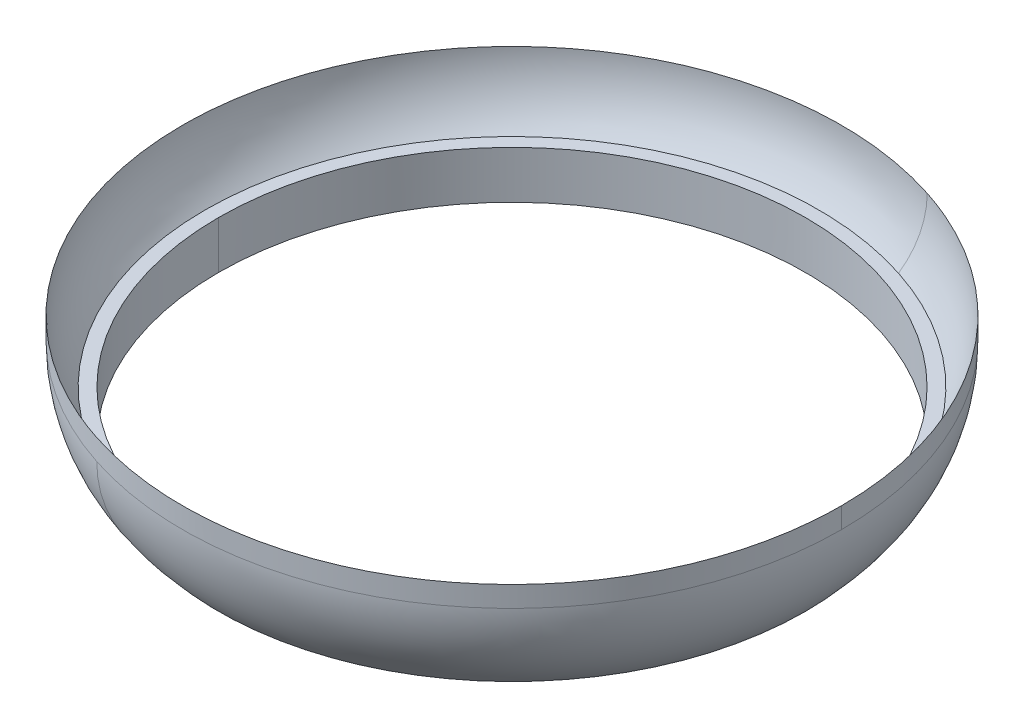
ISO-10303-21;
HEADER;
FILE_DESCRIPTION(('STEP AP214'),'2;1');
FILE_NAME('part.step','',(''),(''),'','','');
FILE_SCHEMA(('AUTOMOTIVE_DESIGN { 1 0 10303 214 1 1 1 1 }'));
ENDSEC;
DATA;
#1=APPLICATION_CONTEXT('core data for automotive mechanical design processes');
#2=APPLICATION_PROTOCOL_DEFINITION('international standard','automotive_design',2000,#1);
#3=PRODUCT_CONTEXT('',#1,'mechanical');
#4=PRODUCT('Part','Part','',(#3));
#5=PRODUCT_RELATED_PRODUCT_CATEGORY('part','',(#4));
#6=PRODUCT_DEFINITION_FORMATION('','',#4);
#7=PRODUCT_DEFINITION_CONTEXT('part definition',#1,'design');
#8=PRODUCT_DEFINITION('design','',#6,#7);
#9=PRODUCT_DEFINITION_SHAPE('','',#8);
#10=(LENGTH_UNIT() NAMED_UNIT(*) SI_UNIT(.MILLI.,.METRE.));
#11=(NAMED_UNIT(*) PLANE_ANGLE_UNIT() SI_UNIT($,.RADIAN.));
#12=(NAMED_UNIT(*) SI_UNIT($,.STERADIAN.) SOLID_ANGLE_UNIT());
#13=UNCERTAINTY_MEASURE_WITH_UNIT(LENGTH_MEASURE(1.E-05),#10,'distance_accuracy_value','');
#14=(GEOMETRIC_REPRESENTATION_CONTEXT(3) GLOBAL_UNCERTAINTY_ASSIGNED_CONTEXT((#13)) GLOBAL_UNIT_ASSIGNED_CONTEXT((#10,
#11,#12)) REPRESENTATION_CONTEXT('',''));
#15=CARTESIAN_POINT('',(0.,0.,0.));
#16=DIRECTION('',(0.,0.,1.));
#17=DIRECTION('',(1.,0.,0.));
#18=AXIS2_PLACEMENT_3D('',#15,#16,#17);
#19=CARTESIAN_POINT('',(0.,-6.07000000000112,0.));
#20=DIRECTION('',(0.,-1.,0.));
#21=DIRECTION('',(0.,0.,-1.));
#22=AXIS2_PLACEMENT_3D('',#19,#20,#21);
#23=PLANE('',#22);
#24=CARTESIAN_POINT('',(0.,-6.07000000025512,0.));
#25=DIRECTION('',(0.,-1.,0.));
#26=DIRECTION('',(1.,0.,0.));
#27=AXIS2_PLACEMENT_3D('',#24,#25,#26);
#28=CIRCLE('',#27,5.0274661);
#29=CARTESIAN_POINT('',(-1.55357246230429,-6.06999999685358,4.78140439104275));
#30=VERTEX_POINT('',#29);
#31=CARTESIAN_POINT('',(1.5535724623043,-6.06999999685358,-4.78140439104275));
#32=VERTEX_POINT('',#31);
#33=EDGE_CURVE('E11',#30,#32,#28,.T.);
#34=ORIENTED_EDGE('',*,*,#33,.F.);
#35=CARTESIAN_POINT('',(0.,-6.07000000025512,0.));
#36=DIRECTION('',(0.,-1.,0.));
#37=DIRECTION('',(0.309016994374947,0.,-0.951056516295154));
#38=AXIS2_PLACEMENT_3D('',#35,#36,#37);
#39=CIRCLE('',#38,5.0274661);
#40=EDGE_CURVE('E24',#32,#30,#39,.T.);
#41=ORIENTED_EDGE('',*,*,#40,.F.);
#42=EDGE_LOOP('',(#34,#41));
#43=FACE_BOUND('',#42,.T.);
#44=CARTESIAN_POINT('',(0.,-6.07000000025512,0.));
#45=DIRECTION('',(0.,1.,0.));
#46=DIRECTION('',(1.,0.,0.));
#47=AXIS2_PLACEMENT_3D('',#44,#45,#46);
#48=CIRCLE('',#47,4.81);
#49=CARTESIAN_POINT('',(-4.81,-6.07000000025512,0.));
#50=VERTEX_POINT('',#49);
#51=CARTESIAN_POINT('',(4.81,-6.07000000025512,0.));
#52=VERTEX_POINT('',#51);
#53=EDGE_CURVE('E246',#50,#52,#48,.T.);
#54=ORIENTED_EDGE('',*,*,#53,.F.);
#55=CARTESIAN_POINT('',(0.,-6.07000000025512,0.));
#56=DIRECTION('',(0.,1.,0.));
#57=DIRECTION('',(1.,0.,0.));
#58=AXIS2_PLACEMENT_3D('',#55,#56,#57);
#59=CIRCLE('',#58,4.81);
#60=EDGE_CURVE('E241',#52,#50,#59,.T.);
#61=ORIENTED_EDGE('',*,*,#60,.F.);
#62=EDGE_LOOP('',(#54,#61));
#63=FACE_BOUND('',#62,.T.);
#64=ADVANCED_FACE('F16',(#43,#63),#23,.F.);
#65=CARTESIAN_POINT('',(0.,-4.96486216263072,0.));
#66=DIRECTION('',(0.,1.,0.));
#67=DIRECTION('',(0.,0.,1.));
#68=AXIS2_PLACEMENT_3D('',#65,#66,#67);
#69=CYLINDRICAL_SURFACE('',#68,4.81);
#70=DIRECTION('',(0.,1.,0.));
#71=VECTOR('',#70,1.);
#72=CARTESIAN_POINT('',(4.81,-6.85000000025454,0.));
#73=LINE('',#72,#71);
#74=CARTESIAN_POINT('',(4.81,-6.85000000025454,0.));
#75=VERTEX_POINT('',#74);
#76=EDGE_CURVE('E236',#75,#52,#73,.T.);
#77=ORIENTED_EDGE('',*,*,#76,.T.);
#78=ORIENTED_EDGE('',*,*,#60,.T.);
#79=DIRECTION('',(0.,1.,0.));
#80=VECTOR('',#79,1.);
#81=CARTESIAN_POINT('',(-4.81,-6.85000000025454,0.));
#82=LINE('',#81,#80);
#83=CARTESIAN_POINT('',(-4.81,-6.85000000025454,0.));
#84=VERTEX_POINT('',#83);
#85=EDGE_CURVE('E231',#84,#50,#82,.T.);
#86=ORIENTED_EDGE('',*,*,#85,.F.);
#87=CARTESIAN_POINT('',(0.,-6.85000000025454,0.));
#88=DIRECTION('',(0.,-1.,0.));
#89=DIRECTION('',(1.,0.,0.));
#90=AXIS2_PLACEMENT_3D('',#87,#88,#89);
#91=CIRCLE('',#90,4.81);
#92=CARTESIAN_POINT('',(1.48637174290435,-6.85000000013163,-4.57458184325921));
#93=VERTEX_POINT('',#92);
#94=EDGE_CURVE('E227',#84,#93,#91,.T.);
#95=ORIENTED_EDGE('',*,*,#94,.T.);
#96=CARTESIAN_POINT('',(0.,-6.85000000025454,0.));
#97=DIRECTION('',(0.,-1.,0.));
#98=DIRECTION('',(1.,0.,0.));
#99=AXIS2_PLACEMENT_3D('',#96,#97,#98);
#100=CIRCLE('',#99,4.81);
#101=EDGE_CURVE('E223',#93,#75,#100,.T.);
#102=ORIENTED_EDGE('',*,*,#101,.T.);
#103=EDGE_LOOP('',(#77,#78,#86,#95,#102));
#104=FACE_BOUND('',#103,.T.);
#105=ADVANCED_FACE('F260',(#104),#69,.F.);
#106=CARTESIAN_POINT('',(0.,-5.39463063107784,0.));
#107=DIRECTION('',(0.,-1.,0.));
#108=DIRECTION('',(-0.951056516295154,0.,-0.309016994374947));
#109=AXIS2_PLACEMENT_3D('',#106,#107,#108);
#110=TOROIDAL_SURFACE('',#109,3.31,2.09);
#111=CARTESIAN_POINT('',(-1.02284625138108,-5.39463063107784,3.14799706893696));
#112=DIRECTION('',(-0.951056516295154,0.,-0.309016994374947));
#113=DIRECTION('',(-0.221782531829319,-0.696348980408513,0.682576447044141));
#114=AXIS2_PLACEMENT_3D('',#111,#112,#113);
#115=CIRCLE('',#114,2.09);
#116=CARTESIAN_POINT('',(-1.48637174290435,-6.85000000013163,4.57458184325921));
#117=VERTEX_POINT('',#116);
#118=CARTESIAN_POINT('',(-1.66869176962471,-5.39463063133184,5.13570518799383));
#119=VERTEX_POINT('',#118);
#120=EDGE_CURVE('E218',#117,#119,#115,.T.);
#121=ORIENTED_EDGE('',*,*,#120,.F.);
#122=CARTESIAN_POINT('',(0.,-6.85000000025454,0.));
#123=DIRECTION('',(0.,-1.,0.));
#124=DIRECTION('',(1.,0.,0.));
#125=AXIS2_PLACEMENT_3D('',#122,#123,#124);
#126=CIRCLE('',#125,4.81);
#127=EDGE_CURVE('E213',#75,#117,#126,.T.);
#128=ORIENTED_EDGE('',*,*,#127,.F.);
#129=ORIENTED_EDGE('',*,*,#101,.F.);
#130=CARTESIAN_POINT('',(1.02284625138108,-5.39463063107784,-3.14799706893696));
#131=DIRECTION('',(0.951056516295154,0.,0.309016994374947));
#132=DIRECTION('',(0.221782531829319,-0.696348980408513,-0.682576447044141));
#133=AXIS2_PLACEMENT_3D('',#130,#131,#132);
#134=CIRCLE('',#133,2.09);
#135=CARTESIAN_POINT('',(1.66869176962472,-5.39463063133184,-5.13570518799383));
#136=VERTEX_POINT('',#135);
#137=EDGE_CURVE('E209',#93,#136,#134,.T.);
#138=ORIENTED_EDGE('',*,*,#137,.T.);
#139=CARTESIAN_POINT('',(0.,-5.39463063133184,0.));
#140=DIRECTION('',(0.,-1.,0.));
#141=DIRECTION('',(1.,0.,0.));
#142=AXIS2_PLACEMENT_3D('',#139,#140,#141);
#143=CIRCLE('',#142,5.4);
#144=CARTESIAN_POINT('',(5.4,-5.39463063133184,0.));
#145=VERTEX_POINT('',#144);
#146=EDGE_CURVE('E205',#136,#145,#143,.T.);
#147=ORIENTED_EDGE('',*,*,#146,.T.);
#148=CARTESIAN_POINT('',(0.,-5.39463063133184,0.));
#149=DIRECTION('',(0.,-1.,0.));
#150=DIRECTION('',(1.,0.,0.));
#151=AXIS2_PLACEMENT_3D('',#148,#149,#150);
#152=CIRCLE('',#151,5.4);
#153=EDGE_CURVE('E201',#145,#119,#152,.T.);
#154=ORIENTED_EDGE('',*,*,#153,.T.);
#155=EDGE_LOOP('',(#121,#128,#129,#138,#147,#154));
#156=FACE_BOUND('',#155,.T.);
#157=ADVANCED_FACE('F189',(#156),#110,.T.);
#158=CARTESIAN_POINT('',(0.,-4.96486216263072,0.));
#159=DIRECTION('',(0.,1.,0.));
#160=DIRECTION('',(0.,0.,-1.));
#161=AXIS2_PLACEMENT_3D('',#158,#159,#160);
#162=CYLINDRICAL_SURFACE('',#161,5.4);
#163=DIRECTION('',(0.,1.,0.));
#164=VECTOR('',#163,1.);
#165=CARTESIAN_POINT('',(5.4,-5.39463063133184,0.));
#166=LINE('',#165,#164);
#167=CARTESIAN_POINT('',(5.4,-5.05463063133066,0.));
#168=VERTEX_POINT('',#167);
#169=EDGE_CURVE('E164',#145,#168,#166,.T.);
#170=ORIENTED_EDGE('',*,*,#169,.T.);
#171=CARTESIAN_POINT('',(-1.66869176962473,-5.05463063133066,5.13570518799383));
#172=CARTESIAN_POINT('',(-1.56785342330559,-5.05463063133066,5.16847363719456));
#173=CARTESIAN_POINT('',(-1.46604809653138,-5.05463063133066,5.19826474257994));
#174=CARTESIAN_POINT('',(-1.26086093523235,-5.05463063133066,5.25180545491086));
#175=CARTESIAN_POINT('',(-1.15747910070751,-5.05463063133066,5.27555506185639));
#176=CARTESIAN_POINT('',(-0.949496377066701,-5.05463063133066,5.31692596649849));
#177=CARTESIAN_POINT('',(-0.844895487950725,-5.05463063133066,5.33454726419505));
#178=CARTESIAN_POINT('',(-0.634837802214555,-5.05463063133066,5.36360161259558));
#179=CARTESIAN_POINT('',(-0.529381005594359,-5.05463063133066,5.37503466329954));
#180=CARTESIAN_POINT('',(-0.317977228266389,-5.05463063133066,5.39167254101824));
#181=CARTESIAN_POINT('',(-0.212030247558615,-5.05463063133066,5.39687736803299));
#182=CARTESIAN_POINT('',(-1.3631016198686E-05,-5.05463063133066,5.40104082917331));
#183=CARTESIAN_POINT('',(0.106056004818443,-5.05463063133066,5.3999994632989));
#184=CARTESIAN_POINT('',(0.317950005379466,-5.05463063133066,5.39167412810091));
#185=CARTESIAN_POINT('',(0.423774370105848,-5.05463063133066,5.38439015877734));
#186=CARTESIAN_POINT('',(0.634810745453375,-5.05463063133066,5.36360488928239));
#187=CARTESIAN_POINT('',(0.740022756074519,-5.05463063133066,5.35010358911102));
#188=CARTESIAN_POINT('',(0.94946946635994,-5.05463063133066,5.31693048931647));
#189=CARTESIAN_POINT('',(1.05370416602422,-5.05463063133066,5.29725868969329));
#190=CARTESIAN_POINT('',(1.2608346870783,-5.05463063133066,5.25181282857214));
#191=CARTESIAN_POINT('',(1.36373050846811,-5.05463063133066,5.22603876707416));
#192=CARTESIAN_POINT('',(1.56782635007466,-5.05463063133066,5.16847778662524));
#193=CARTESIAN_POINT('',(1.6690263702914,-5.05463063133066,5.13669086767431));
#194=CARTESIAN_POINT('',(1.86937956897485,-5.05463063133066,5.06721443416799));
#195=CARTESIAN_POINT('',(1.96853274744156,-5.05463063133066,5.0295249196126));
#196=CARTESIAN_POINT('',(2.16444832210138,-5.05463063133066,4.94837403150931));
#197=CARTESIAN_POINT('',(2.26121071829448,-5.05463063133066,4.9049126579614));
#198=CARTESIAN_POINT('',(2.45200908097758,-5.05463063133066,4.81236880980261));
#199=CARTESIAN_POINT('',(2.54604504746758,-5.05463063133066,4.76328633519172));
#200=CARTESIAN_POINT('',(2.73106436069951,-5.05463063133066,4.65967054119451));
#201=CARTESIAN_POINT('',(2.82204770744145,-5.05463063133066,4.60513722180818));
#202=CARTESIAN_POINT('',(3.00064617999733,-5.05463063133066,4.49080890232773));
#203=CARTESIAN_POINT('',(3.08826130581127,-5.05463063133066,4.43101390223361));
#204=CARTESIAN_POINT('',(3.25981941894741,-5.05463063133066,4.30636963701585));
#205=CARTESIAN_POINT('',(3.34376240626961,-5.05463063133066,4.24152037189221));
#206=CARTESIAN_POINT('',(3.50768506269774,-5.05463063133066,4.10699252442537));
#207=CARTESIAN_POINT('',(3.58766473180367,-5.05463063133066,4.03731394208216));
#208=CARTESIAN_POINT('',(3.74338331995207,-5.05463063133066,3.89336915982327));
#209=CARTESIAN_POINT('',(3.81912223899453,-5.05463063133066,3.81910295990759));
#210=CARTESIAN_POINT('',(3.96609660539697,-5.05463063133066,3.66624055558531));
#211=CARTESIAN_POINT('',(4.03733205275696,-5.05463063133066,3.5876443511787));
#212=CARTESIAN_POINT('',(4.17505237572335,-5.05463063133066,3.42639457078731));
#213=CARTESIAN_POINT('',(4.24153725132976,-5.05463063133066,3.34374099480253));
#214=CARTESIAN_POINT('',(4.36952580941546,-5.05463063133066,3.17466317829607));
#215=CARTESIAN_POINT('',(4.43102949189475,-5.05463063133066,3.0882389377744));
#216=CARTESIAN_POINT('',(4.54884232097271,-5.05463063133066,2.91191957883734));
#217=CARTESIAN_POINT('',(4.60515146757138,-5.05463063133066,2.82202446042196));
#218=CARTESIAN_POINT('',(4.71237990098875,-5.05463063133066,2.63907517206031));
#219=CARTESIAN_POINT('',(4.76329918780746,-5.05463063133066,2.54602100211403));
#220=CARTESIAN_POINT('',(4.8595712734269,-5.05463063133066,2.35707639507311));
#221=CARTESIAN_POINT('',(4.90492407222763,-5.05463063133066,2.26118595797847));
#222=CARTESIAN_POINT('',(4.98990586463742,-5.05463063133066,2.06690143953549));
#223=CARTESIAN_POINT('',(5.02953485824649,-5.05463063133066,1.96850735818716));
#224=CARTESIAN_POINT('',(5.10293156971633,-5.05463063133066,1.7695568582498));
#225=CARTESIAN_POINT('',(5.13669928757711,-5.05463063133066,1.66900043966077));
#226=CARTESIAN_POINT('',(5.19825633833074,-5.05463063133066,1.46607407468747));
#227=CARTESIAN_POINT('',(5.2260456712236,-5.05463063133066,1.3637041283032));
#228=CARTESIAN_POINT('',(5.2755494690713,-5.05463063133066,1.15750580134062));
#229=CARTESIAN_POINT('',(5.29726393402615,-5.05463063133066,1.05367742076229));
#230=CARTESIAN_POINT('',(5.33454300134467,-5.05463063133066,0.844922402528778));
#231=CARTESIAN_POINT('',(5.35010760370835,-5.05463063133066,0.739995764873585));
#232=CARTESIAN_POINT('',(5.37503173140485,-5.05463063133066,0.529408127671105));
#233=CARTESIAN_POINT('',(5.38439125673769,-5.05463063133066,0.423747128123817));
#234=CARTESIAN_POINT('',(5.39687733325724,-5.05463063133066,0.212057551309069));
#235=CARTESIAN_POINT('',(5.40000388444397,-5.05463063133066,0.106028974041609));
#236=CARTESIAN_POINT('',(5.4,-5.05463063133066,0.));
#237=B_SPLINE_CURVE_WITH_KNOTS('',3,(#171,#172,#173,#174,#175,#176,#177,#178,#179,#180,#181,
#182,#183,#184,#185,#186,#187,#188,#189,#190,#191,#192,#193,#194,#195,#196,#197,#198,#199,#200,
#201,#202,#203,#204,#205,#206,#207,#208,#209,#210,#211,#212,#213,#214,#215,#216,#217,#218,#219,
#220,#221,#222,#223,#224,#225,#226,#227,#228,#229,#230,#231,#232,#233,#234,#235,#236),
.UNSPECIFIED.,.F.,.F.,(4,2,2,2,2,2,2,2,2,2,2,2,2,2,2,2,2,2,2,2,2,2,2,2,2,2,2,2,2,2,2,2,4),(0.,
0.318040271078004,0.636080542156004,0.954120813234008,1.27216108431201,1.59020135539001,
1.90824162646801,2.22628189754601,2.54432216862401,2.86236243970202,3.18040271078002,
3.49844298185802,3.81648325293602,4.13452352401402,4.45256379509203,4.77060406617003,
5.08864433724803,5.40668460832603,5.72472487940403,6.04276515048203,6.36080542156004,
6.67884569263804,6.99688596371604,7.31492623479404,7.63296650587205,7.95100677695005,
8.26904704802805,8.58708731910605,8.90512759018405,9.22316786126206,9.54120813234006,
9.85924840341806,10.1772886744961),.UNSPECIFIED.);
#238=CARTESIAN_POINT('',(-1.66869176962471,-5.05463063133066,5.13570518799383));
#239=VERTEX_POINT('',#238);
#240=EDGE_CURVE('E103',#239,#168,#237,.T.);
#241=ORIENTED_EDGE('',*,*,#240,.F.);
#242=CARTESIAN_POINT('',(-5.4,-5.05463063133066,1.11957443316157E-11));
#243=CARTESIAN_POINT('',(-5.40000076803796,-5.05463063133066,0.0706858639590786));
#244=CARTESIAN_POINT('',(-5.39861211430546,-5.05463063133066,0.141371675640075));
#245=CARTESIAN_POINT('',(-5.3930614770935,-5.05463063133066,0.282634334579538));
#246=CARTESIAN_POINT('',(-5.38889949361404,-5.05463063133066,0.353211181838005));
#247=CARTESIAN_POINT('',(-5.3778077107021,-5.05463063133066,0.494147052043646));
#248=CARTESIAN_POINT('',(-5.37087791126962,-5.05463063133066,0.564506074990822));
#249=CARTESIAN_POINT('',(-5.3542614238412,-5.05463063133066,0.704897817573973));
#250=CARTESIAN_POINT('',(-5.34457473584525,-5.05463063133066,0.774930537209949));
#251=CARTESIAN_POINT('',(-5.32245934257917,-5.05463063133066,0.914561685243893));
#252=CARTESIAN_POINT('',(-5.31003063730903,-5.05463063133066,0.98416011364186));
#253=CARTESIAN_POINT('',(-5.28245039104218,-5.05463063133066,1.12281536415085));
#254=CARTESIAN_POINT('',(-5.26729885004546,-5.05463063133066,1.19187218626187));
#255=CARTESIAN_POINT('',(-5.2342962902452,-5.05463063133066,1.32933774339959));
#256=CARTESIAN_POINT('',(-5.21644527144164,-5.05463063133066,1.39774647842629));
#257=CARTESIAN_POINT('',(-5.178071282253,-5.05463063133066,1.53381038013335));
#258=CARTESIAN_POINT('',(-5.15754831186791,-5.05463063133066,1.60146554681371));
#259=CARTESIAN_POINT('',(-5.11386206411456,-5.05463063133066,1.73591799245169));
#260=CARTESIAN_POINT('',(-5.09069878674629,-5.05463063133066,1.8027152714093));
#261=CARTESIAN_POINT('',(-5.04176764121098,-5.05463063133066,1.93534894504271));
#262=CARTESIAN_POINT('',(-5.01599977304393,-5.05463063133066,2.00118533971851));
#263=CARTESIAN_POINT('',(-4.96189917807208,-5.05463063133066,2.13179572983867));
#264=CARTESIAN_POINT('',(-4.93356645126727,-5.05463063133067,2.19656972528304));
#265=CARTESIAN_POINT('',(-4.87437982603746,-5.05463063133067,2.32495544013452));
#266=CARTESIAN_POINT('',(-4.84352592761246,-5.05463063133067,2.38856715954164));
#267=CARTESIAN_POINT('',(-4.77934453361557,-5.05463063133067,2.51453023765792));
#268=CARTESIAN_POINT('',(-4.74601703804368,-5.05463063133067,2.57688159636708));
#269=CARTESIAN_POINT('',(-4.67693983833604,-5.05463063133067,2.70022781181163));
#270=CARTESIAN_POINT('',(-4.64119013420028,-5.05463063133067,2.76122266854702));
#271=CARTESIAN_POINT('',(-4.56732364081734,-5.05463063133067,2.88176183039596));
#272=CARTESIAN_POINT('',(-4.52920685157017,-5.05463063133067,2.9413061355095));
#273=CARTESIAN_POINT('',(-4.45066496129071,-5.05463063133067,3.05885238111209));
#274=CARTESIAN_POINT('',(-4.41023986025842,-5.05463063133067,3.11685432160115));
#275=CARTESIAN_POINT('',(-4.32714367898444,-5.05463063133067,3.23122640316661));
#276=CARTESIAN_POINT('',(-4.28447259874274,-5.05463063133067,3.28759654424301));
#277=CARTESIAN_POINT('',(-4.19695025476282,-5.05463063133067,3.39861810831143));
#278=CARTESIAN_POINT('',(-4.15209899102459,-5.05463063133067,3.45326953130344));
#279=CARTESIAN_POINT('',(-4.06028543744939,-5.05463063133067,3.56076939066999));
#280=CARTESIAN_POINT('',(-4.01332314761242,-5.05463063133067,3.61361782704453));
#281=CARTESIAN_POINT('',(-3.91735995428682,-5.05463063133067,3.71743022471791));
#282=CARTESIAN_POINT('',(-3.86835905079818,-5.05463063133067,3.76839418601675));
#283=CARTESIAN_POINT('',(-3.76839418601061,-5.05463063133067,3.86835905080389));
#284=CARTESIAN_POINT('',(-3.71743022471167,-5.05463063133067,3.91735995429221));
#285=CARTESIAN_POINT('',(-3.61361782703846,-5.05463063133067,4.01332314761841));
#286=CARTESIAN_POINT('',(-3.5607693906642,-5.05463063133067,4.0602854374563));
#287=CARTESIAN_POINT('',(-3.45326953129648,-5.05463063133067,4.15209899102857));
#288=CARTESIAN_POINT('',(-3.39861810830302,-5.05463063133067,4.19695025476296));
#289=CARTESIAN_POINT('',(-3.28759654423826,-5.05463063133067,4.28447259875298));
#290=CARTESIAN_POINT('',(-3.23122640316696,-5.05463063133067,4.32714367900861));
#291=CARTESIAN_POINT('',(-3.11685432158723,-5.05463063133067,4.4102398602441));
#292=CARTESIAN_POINT('',(-3.0588523810788,-5.05463063133067,4.45066496122395));
#293=CARTESIAN_POINT('',(-2.94130613552885,-5.05463063133067,4.52920685164625));
#294=CARTESIAN_POINT('',(-2.88176183048733,-5.05463063133067,4.5673236410887));
#295=CARTESIAN_POINT('',(-2.76122266844136,-5.05463063133067,4.64119013393768));
#296=CARTESIAN_POINT('',(-2.70022781143692,-5.05463063133067,4.67693983734423));
#297=CARTESIAN_POINT('',(-2.57688159672717,-5.05463063133067,4.74601703904368));
#298=CARTESIAN_POINT('',(-2.51453023902186,-5.05463063133067,4.77934453733659));
#299=CARTESIAN_POINT('',(-2.38856715816278,-5.05463063133067,4.84352592389904));
#300=CARTESIAN_POINT('',(-2.324955435009,-5.05463063133067,4.87437981216858));
#301=CARTESIAN_POINT('',(-2.19656973039334,-5.05463063133067,4.93356646514316));
#302=CARTESIAN_POINT('',(-2.13179574893145,-5.05463063133067,4.9618992298482));
#303=CARTESIAN_POINT('',(-2.00118532061025,-5.05463063133067,5.01599972127422));
#304=CARTESIAN_POINT('',(-1.93534887375092,-5.05463063133067,5.04176744799521));
#305=CARTESIAN_POINT('',(-1.80271534268537,-5.05463063133067,5.09069897996785));
#306=CARTESIAN_POINT('',(-1.73591825847914,-5.05463063133067,5.1138627852195));
#307=CARTESIAN_POINT('',(-1.66869176962473,-5.05463063133067,5.13570518799383));
#308=B_SPLINE_CURVE_WITH_KNOTS('',3,(#242,#243,#244,#245,#246,#247,#248,#249,#250,#251,#252,
#253,#254,#255,#256,#257,#258,#259,#260,#261,#262,#263,#264,#265,#266,#267,#268,#269,#270,#271,
#272,#273,#274,#275,#276,#277,#278,#279,#280,#281,#282,#283,#284,#285,#286,#287,#288,#289,#290,
#291,#292,#293,#294,#295,#296,#297,#298,#299,#300,#301,#302,#303,#304,#305,#306,#307),
.UNSPECIFIED.,.F.,.F.,(4,2,2,2,2,2,2,2,2,2,2,2,2,2,2,2,2,2,2,2,2,2,2,2,2,2,2,2,2,2,2,2,4),(0.,
0.212043878574434,0.424087757148871,0.636131635723306,0.848175514297743,1.06021939287218,
1.27226327144661,1.48430715002105,1.69635102859549,1.90839490716992,2.12043878574435,
2.33248266431879,2.54452654289323,2.75657042146766,2.9686143000421,3.18065817861653,
3.39270205719097,3.6047459357654,3.81678981433984,4.02883369291427,4.24087757148871,
4.45292145006314,4.66496532863758,4.87700920721202,5.08905308578645,5.30109696436089,
5.51314084293532,5.72518472150976,5.93722860008419,6.14927247865863,6.36131635723306,
6.5733602358075,6.78540411438194),.UNSPECIFIED.);
#309=CARTESIAN_POINT('',(-5.4,-5.05463063133066,0.));
#310=VERTEX_POINT('',#309);
#311=EDGE_CURVE('E143',#310,#239,#308,.T.);
#312=ORIENTED_EDGE('',*,*,#311,.F.);
#313=DIRECTION('',(0.,1.,0.));
#314=VECTOR('',#313,1.);
#315=CARTESIAN_POINT('',(-5.4,-5.39463063133184,0.));
#316=LINE('',#315,#314);
#317=CARTESIAN_POINT('',(-5.4,-5.39463063133184,0.));
#318=VERTEX_POINT('',#317);
#319=EDGE_CURVE('E88',#318,#310,#316,.T.);
#320=ORIENTED_EDGE('',*,*,#319,.F.);
#321=CARTESIAN_POINT('',(0.,-5.39463063133184,0.));
#322=DIRECTION('',(0.,-1.,0.));
#323=DIRECTION('',(1.,0.,0.));
#324=AXIS2_PLACEMENT_3D('',#321,#322,#323);
#325=CIRCLE('',#324,5.4);
#326=EDGE_CURVE('E165',#119,#318,#325,.T.);
#327=ORIENTED_EDGE('',*,*,#326,.F.);
#328=ORIENTED_EDGE('',*,*,#153,.F.);
#329=EDGE_LOOP('',(#170,#241,#312,#320,#327,#328));
#330=FACE_BOUND('',#329,.T.);
#331=ADVANCED_FACE('F179',(#330),#162,.T.);
#332=CARTESIAN_POINT('',(0.,-5.39463063107784,0.));
#333=DIRECTION('',(0.,-1.,0.));
#334=DIRECTION('',(0.951056516295154,0.,0.309016994374947));
#335=AXIS2_PLACEMENT_3D('',#332,#333,#334);
#336=TOROIDAL_SURFACE('',#335,3.31,2.09);
#337=ORIENTED_EDGE('',*,*,#120,.T.);
#338=ORIENTED_EDGE('',*,*,#326,.T.);
#339=CARTESIAN_POINT('',(0.,-5.39463063133184,0.));
#340=DIRECTION('',(0.,-1.,0.));
#341=DIRECTION('',(1.,0.,0.));
#342=AXIS2_PLACEMENT_3D('',#339,#340,#341);
#343=CIRCLE('',#342,5.4);
#344=EDGE_CURVE('E168',#318,#136,#343,.T.);
#345=ORIENTED_EDGE('',*,*,#344,.T.);
#346=ORIENTED_EDGE('',*,*,#137,.F.);
#347=ORIENTED_EDGE('',*,*,#94,.F.);
#348=CARTESIAN_POINT('',(0.,-6.85000000025454,0.));
#349=DIRECTION('',(0.,-1.,0.));
#350=DIRECTION('',(1.,0.,0.));
#351=AXIS2_PLACEMENT_3D('',#348,#349,#350);
#352=CIRCLE('',#351,4.81);
#353=EDGE_CURVE('E92',#117,#84,#352,.T.);
#354=ORIENTED_EDGE('',*,*,#353,.F.);
#355=EDGE_LOOP('',(#337,#338,#345,#346,#347,#354));
#356=FACE_BOUND('',#355,.T.);
#357=ADVANCED_FACE('F188',(#356),#336,.T.);
#358=CARTESIAN_POINT('',(0.,-4.96486216263072,0.));
#359=DIRECTION('',(0.,1.,0.));
#360=DIRECTION('',(0.,0.,-1.));
#361=AXIS2_PLACEMENT_3D('',#358,#359,#360);
#362=CYLINDRICAL_SURFACE('',#361,4.81);
#363=ORIENTED_EDGE('',*,*,#76,.F.);
#364=ORIENTED_EDGE('',*,*,#127,.T.);
#365=ORIENTED_EDGE('',*,*,#353,.T.);
#366=ORIENTED_EDGE('',*,*,#85,.T.);
#367=ORIENTED_EDGE('',*,*,#53,.T.);
#368=EDGE_LOOP('',(#363,#364,#365,#366,#367));
#369=FACE_BOUND('',#368,.T.);
#370=ADVANCED_FACE('F128',(#369),#362,.F.);
#371=CARTESIAN_POINT('',(0.,-4.96486216263072,0.));
#372=DIRECTION('',(0.,1.,0.));
#373=DIRECTION('',(0.,0.,1.));
#374=AXIS2_PLACEMENT_3D('',#371,#372,#373);
#375=CYLINDRICAL_SURFACE('',#374,5.4);
#376=ORIENTED_EDGE('',*,*,#169,.F.);
#377=ORIENTED_EDGE('',*,*,#146,.F.);
#378=ORIENTED_EDGE('',*,*,#344,.F.);
#379=ORIENTED_EDGE('',*,*,#319,.T.);
#380=CARTESIAN_POINT('',(1.66869176962473,-5.05463063133066,-5.13570518799383));
#381=CARTESIAN_POINT('',(1.56785342330548,-5.05463063133066,-5.1684736371946));
#382=CARTESIAN_POINT('',(1.46604809653116,-5.05463063133066,-5.19826474258001));
#383=CARTESIAN_POINT('',(1.26086093523189,-5.05463063133066,-5.25180545491097));
#384=CARTESIAN_POINT('',(1.15747910070694,-5.05463063133066,-5.27555506185652));
#385=CARTESIAN_POINT('',(0.949496377065897,-5.05463063133066,-5.31692596649864));
#386=CARTESIAN_POINT('',(0.844895487949803,-5.05463063133066,-5.3345472641952));
#387=CARTESIAN_POINT('',(0.634837802213395,-5.05463063133066,-5.36360161259572));
#388=CARTESIAN_POINT('',(0.529381005593081,-5.05463063133066,-5.37503466329967));
#389=CARTESIAN_POINT('',(0.317977228264872,-5.05463063133066,-5.39167254101833));
#390=CARTESIAN_POINT('',(0.212030247556978,-5.05463063133066,-5.39687736803305));
#391=CARTESIAN_POINT('',(1.3631014325415E-05,-5.05463063133066,-5.40104082917332));
#392=CARTESIAN_POINT('',(-0.106056004820432,-5.05463063133066,-5.39999946329886));
#393=CARTESIAN_POINT('',(-0.317950005381684,-5.05463063133066,-5.39167412810078));
#394=CARTESIAN_POINT('',(-0.423774370108178,-5.05463063133066,-5.38439015877716));
#395=CARTESIAN_POINT('',(-0.634810745455928,-5.05463063133066,-5.36360488928209));
#396=CARTESIAN_POINT('',(-0.740022756077183,-5.05463063133066,-5.35010358911065));
#397=CARTESIAN_POINT('',(-0.949469466362818,-5.05463063133066,-5.31693048931596));
#398=CARTESIAN_POINT('',(-1.0537041660272,-5.05463063133066,-5.2972586896927));
#399=CARTESIAN_POINT('',(-1.26083468708148,-5.05463063133066,-5.25181282857137));
#400=CARTESIAN_POINT('',(-1.36373050847139,-5.05463063133066,-5.2260387670733));
#401=CARTESIAN_POINT('',(-1.56782635007813,-5.05463063133066,-5.16847778662419));
#402=CARTESIAN_POINT('',(-1.66902637029496,-5.05463063133066,-5.13669086767315));
#403=CARTESIAN_POINT('',(-1.86937956897858,-5.05463063133066,-5.06721443416661));
#404=CARTESIAN_POINT('',(-1.96853274744537,-5.05463063133066,-5.02952491961111));
#405=CARTESIAN_POINT('',(-2.16444832210534,-5.05463063133066,-4.94837403150758));
#406=CARTESIAN_POINT('',(-2.26121071829852,-5.05463063133066,-4.90491265795954));
#407=CARTESIAN_POINT('',(-2.45200908098175,-5.05463063133066,-4.81236880980049));
#408=CARTESIAN_POINT('',(-2.5460450474718,-5.05463063133066,-4.76328633518946));
#409=CARTESIAN_POINT('',(-2.73106436070384,-5.05463063133066,-4.65967054119197));
#410=CARTESIAN_POINT('',(-2.82204770744583,-5.05463063133066,-4.6051372218055));
#411=CARTESIAN_POINT('',(-3.0006461800018,-5.05463063133066,-4.49080890232475));
#412=CARTESIAN_POINT('',(-3.08826130581578,-5.05463063133066,-4.43101390223047));
#413=CARTESIAN_POINT('',(-3.25981941895198,-5.05463063133066,-4.30636963701239));
#414=CARTESIAN_POINT('',(-3.3437624062742,-5.05463063133066,-4.2415203718886));
#415=CARTESIAN_POINT('',(-3.50768506270236,-5.05463063133066,-4.10699252442143));
#416=CARTESIAN_POINT('',(-3.58766473180831,-5.05463063133066,-4.03731394207805));
#417=CARTESIAN_POINT('',(-3.74338331995671,-5.05463063133066,-3.89336915981882));
#418=CARTESIAN_POINT('',(-3.81912223899916,-5.05463063133066,-3.81910295990296));
#419=CARTESIAN_POINT('',(-3.96609660540157,-5.05463063133066,-3.66624055558033));
#420=CARTESIAN_POINT('',(-4.03733205276154,-5.05463063133066,-3.58764435117355));
#421=CARTESIAN_POINT('',(-4.17505237572788,-5.05463063133066,-3.4263945707818));
#422=CARTESIAN_POINT('',(-4.24153725133425,-5.05463063133066,-3.34374099479684));
#423=CARTESIAN_POINT('',(-4.36952580941986,-5.05463063133066,-3.17466317829002));
#424=CARTESIAN_POINT('',(-4.4310294918991,-5.05463063133066,-3.08823893776816));
#425=CARTESIAN_POINT('',(-4.54884232097694,-5.05463063133066,-2.91191957883075));
#426=CARTESIAN_POINT('',(-4.60515146757553,-5.05463063133066,-2.82202446041519));
#427=CARTESIAN_POINT('',(-4.71237990099275,-5.05463063133066,-2.63907517205317));
#428=CARTESIAN_POINT('',(-4.76329918781137,-5.05463063133066,-2.54602100210671));
#429=CARTESIAN_POINT('',(-4.85957127343062,-5.05463063133066,-2.35707639506543));
#430=CARTESIAN_POINT('',(-4.90492407223125,-5.05463063133066,-2.26118595797061));
#431=CARTESIAN_POINT('',(-4.98990586464082,-5.05463063133066,-2.06690143952729));
#432=CARTESIAN_POINT('',(-5.02953485824977,-5.05463063133066,-1.96850735817878));
#433=CARTESIAN_POINT('',(-5.10293156971936,-5.05463063133066,-1.76955685824108));
#434=CARTESIAN_POINT('',(-5.13669928758,-5.05463063133066,-1.66900043965187));
#435=CARTESIAN_POINT('',(-5.19825633833334,-5.05463063133066,-1.46607407467824));
#436=CARTESIAN_POINT('',(-5.22604567122605,-5.05463063133066,-1.36370412829382));
#437=CARTESIAN_POINT('',(-5.27554946907343,-5.05463063133066,-1.15750580133091));
#438=CARTESIAN_POINT('',(-5.29726393402811,-5.05463063133066,-1.05367742075244));
#439=CARTESIAN_POINT('',(-5.33454300134628,-5.05463063133066,-0.84492240251862));
#440=CARTESIAN_POINT('',(-5.35010760370977,-5.05463063133066,-0.739995764863282));
#441=CARTESIAN_POINT('',(-5.3750317314059,-5.05463063133066,-0.529408127660521));
#442=CARTESIAN_POINT('',(-5.38439125673853,-5.05463063133066,-0.423747128113098));
#443=CARTESIAN_POINT('',(-5.39687733325768,-5.05463063133066,-0.21205755129809));
#444=CARTESIAN_POINT('',(-5.40000388444419,-5.05463063133066,-0.106028974030506));
#445=CARTESIAN_POINT('',(-5.4,-5.05463063133066,1.11957443316157E-11));
#446=B_SPLINE_CURVE_WITH_KNOTS('',3,(#380,#381,#382,#383,#384,#385,#386,#387,#388,#389,#390,
#391,#392,#393,#394,#395,#396,#397,#398,#399,#400,#401,#402,#403,#404,#405,#406,#407,#408,#409,
#410,#411,#412,#413,#414,#415,#416,#417,#418,#419,#420,#421,#422,#423,#424,#425,#426,#427,#428,
#429,#430,#431,#432,#433,#434,#435,#436,#437,#438,#439,#440,#441,#442,#443,#444,#445),
.UNSPECIFIED.,.F.,.F.,(4,2,2,2,2,2,2,2,2,2,2,2,2,2,2,2,2,2,2,2,2,2,2,2,2,2,2,2,2,2,2,2,4),(0.,
0.318040271078354,0.636080542156703,0.954120813235057,1.27216108431341,1.59020135539177,
1.90824162647011,2.22628189754846,2.54432216862682,2.86236243970517,3.18040271078352,
3.49844298186187,3.81648325294023,4.13452352401858,4.45256379509693,4.77060406617529,
5.08864433725364,5.40668460833199,5.72472487941034,6.04276515048869,6.36080542156705,
6.6788456926454,6.99688596372375,7.3149262348021,7.63296650588046,7.95100677695881,
8.26904704803716,8.58708731911551,8.90512759019387,9.22316786127222,9.54120813235057,
9.85924840342892,10.1772886745073),.UNSPECIFIED.);
#447=CARTESIAN_POINT('',(1.66869176962472,-5.05463063133066,-5.13570518799383));
#448=VERTEX_POINT('',#447);
#449=EDGE_CURVE('E78',#448,#310,#446,.T.);
#450=ORIENTED_EDGE('',*,*,#449,.F.);
#451=CARTESIAN_POINT('',(5.4,-5.05463063133066,0.));
#452=CARTESIAN_POINT('',(5.4000007680381,-5.05463063133066,-0.070685863947991));
#453=CARTESIAN_POINT('',(5.39861211430575,-5.05463063133066,-0.141371675629107));
#454=CARTESIAN_POINT('',(5.39306147709406,-5.05463063133066,-0.282634334568814));
#455=CARTESIAN_POINT('',(5.38889949361473,-5.05463063133066,-0.353211181827406));
#456=CARTESIAN_POINT('',(5.37780771070305,-5.05463063133066,-0.494147052033302));
#457=CARTESIAN_POINT('',(5.3708779112707,-5.05463063133066,-0.564506074980607));
#458=CARTESIAN_POINT('',(5.35426142384251,-5.05463063133066,-0.704897817564021));
#459=CARTESIAN_POINT('',(5.34457473584668,-5.05463063133066,-0.774930537200131));
#460=CARTESIAN_POINT('',(5.32245934258081,-5.05463063133066,-0.914561685234345));
#461=CARTESIAN_POINT('',(5.31003063731078,-5.05463063133066,-0.98416011363245));
#462=CARTESIAN_POINT('',(5.28245039104412,-5.05463063133066,-1.12281536414172));
#463=CARTESIAN_POINT('',(5.2672988500475,-5.05463063133066,-1.19187218625288));
#464=CARTESIAN_POINT('',(5.23429629024741,-5.05463063133066,-1.32933774339088));
#465=CARTESIAN_POINT('',(5.21644527144394,-5.05463063133066,-1.39774647841772));
#466=CARTESIAN_POINT('',(5.17807128225546,-5.05463063133066,-1.53381038012507));
#467=CARTESIAN_POINT('',(5.15754831187044,-5.05463063133066,-1.60146554680557));
#468=CARTESIAN_POINT('',(5.11386206411722,-5.05463063133066,-1.73591799244384));
#469=CARTESIAN_POINT('',(5.09069878674902,-5.05463063133066,-1.8027152714016));
#470=CARTESIAN_POINT('',(5.04176764121382,-5.05463063133066,-1.9353489450353));
#471=CARTESIAN_POINT('',(5.01599977304683,-5.05463063133066,-2.00118533971125));
#472=CARTESIAN_POINT('',(4.96189917807508,-5.05463063133066,-2.1317957298317));
#473=CARTESIAN_POINT('',(4.93356645127031,-5.05463063133066,-2.19656972527621));
#474=CARTESIAN_POINT('',(4.87437982604058,-5.05463063133066,-2.32495544012799));
#475=CARTESIAN_POINT('',(4.84352592761561,-5.05463063133066,-2.38856715953526));
#476=CARTESIAN_POINT('',(4.77934453361878,-5.05463063133066,-2.51453023765183));
#477=CARTESIAN_POINT('',(4.74601703804691,-5.05463063133066,-2.57688159636113));
#478=CARTESIAN_POINT('',(4.67693983833931,-5.05463063133066,-2.70022781180597));
#479=CARTESIAN_POINT('',(4.64119013420356,-5.05463063133066,-2.76122266854151));
#480=CARTESIAN_POINT('',(4.56732364082065,-5.05463063133066,-2.88176183039072));
#481=CARTESIAN_POINT('',(4.52920685157348,-5.05463063133066,-2.94130613550441));
#482=CARTESIAN_POINT('',(4.45066496129402,-5.05463063133066,-3.05885238110728));
#483=CARTESIAN_POINT('',(4.41023986026172,-5.05463063133066,-3.11685432159648));
#484=CARTESIAN_POINT('',(4.32714367898772,-5.05463063133066,-3.23122640316221));
#485=CARTESIAN_POINT('',(4.28447259874601,-5.05463063133066,-3.28759654423875));
#486=CARTESIAN_POINT('',(4.19695025476605,-5.05463063133066,-3.39861810830744));
#487=CARTESIAN_POINT('',(4.1520989910278,-5.05463063133066,-3.45326953129958));
#488=CARTESIAN_POINT('',(4.06028543745255,-5.05463063133066,-3.56076939066639));
#489=CARTESIAN_POINT('',(4.01332314761555,-5.05463063133067,-3.61361782704106));
#490=CARTESIAN_POINT('',(3.91735995428987,-5.05463063133067,-3.71743022471469));
#491=CARTESIAN_POINT('',(3.8683590508012,-5.05463063133067,-3.76839418601365));
#492=CARTESIAN_POINT('',(3.76839418601353,-5.05463063133067,-3.86835905080105));
#493=CARTESIAN_POINT('',(3.71743022471455,-5.05463063133067,-3.91735995428948));
#494=CARTESIAN_POINT('',(3.61361782704124,-5.05463063133067,-4.01332314761591));
#495=CARTESIAN_POINT('',(3.56076939066692,-5.05463063133067,-4.06028543745391));
#496=CARTESIAN_POINT('',(3.45326953129908,-5.05463063133067,-4.15209899102641));
#497=CARTESIAN_POINT('',(3.39861810830556,-5.05463063133067,-4.1969502547609));
#498=CARTESIAN_POINT('',(3.28759654424067,-5.05463063133067,-4.28447259875113));
#499=CARTESIAN_POINT('',(3.2312264031693,-5.05463063133067,-4.32714367900687));
#500=CARTESIAN_POINT('',(3.11685432158943,-5.05463063133067,-4.41023986024255));
#501=CARTESIAN_POINT('',(3.05885238108092,-5.05463063133067,-4.4506649612225));
#502=CARTESIAN_POINT('',(2.94130613553081,-5.05463063133067,-4.52920685164498));
#503=CARTESIAN_POINT('',(2.8817618304892,-5.05463063133067,-4.56732364108751));
#504=CARTESIAN_POINT('',(2.76122266844307,-5.05463063133067,-4.64119013393667));
#505=CARTESIAN_POINT('',(2.70022781143854,-5.05463063133067,-4.6769398373433));
#506=CARTESIAN_POINT('',(2.5768815967286,-5.05463063133067,-4.7460170390429));
#507=CARTESIAN_POINT('',(2.5145302390232,-5.05463063133067,-4.77934453733588));
#508=CARTESIAN_POINT('',(2.38856715816393,-5.05463063133067,-4.84352592389848));
#509=CARTESIAN_POINT('',(2.32495543501006,-5.05463063133067,-4.87437981216808));
#510=CARTESIAN_POINT('',(2.1965697303942,-5.05463063133067,-4.93356646514278));
#511=CARTESIAN_POINT('',(2.13179574893221,-5.05463063133067,-4.96189922984788));
#512=CARTESIAN_POINT('',(2.00118532061079,-5.05463063133067,-5.01599972127401));
#513=CARTESIAN_POINT('',(1.93534887375136,-5.05463063133067,-5.04176744799505));
#514=CARTESIAN_POINT('',(1.80271534268559,-5.05463063133067,-5.09069897996777));
#515=CARTESIAN_POINT('',(1.73591825847925,-5.05463063133067,-5.11386278521946));
#516=CARTESIAN_POINT('',(1.66869176962473,-5.05463063133067,-5.13570518799383));
#517=B_SPLINE_CURVE_WITH_KNOTS('',3,(#451,#452,#453,#454,#455,#456,#457,#458,#459,#460,#461,
#462,#463,#464,#465,#466,#467,#468,#469,#470,#471,#472,#473,#474,#475,#476,#477,#478,#479,#480,
#481,#482,#483,#484,#485,#486,#487,#488,#489,#490,#491,#492,#493,#494,#495,#496,#497,#498,#499,
#500,#501,#502,#503,#504,#505,#506,#507,#508,#509,#510,#511,#512,#513,#514,#515,#516),
.UNSPECIFIED.,.F.,.F.,(4,2,2,2,2,2,2,2,2,2,2,2,2,2,2,2,2,2,2,2,2,2,2,2,2,2,2,2,2,2,2,2,4),(0.,
0.212043878574784,0.424087757149571,0.636131635724356,0.848175514299143,1.06021939287393,
1.27226327144871,1.4843071500235,1.69635102859829,1.90839490717307,2.12043878574785,
2.33248266432264,2.54452654289743,2.75657042147221,2.968614300047,3.18065817862178,
3.39270205719657,3.60474593577135,3.81678981434614,4.02883369292093,4.24087757149571,
4.4529214500705,4.66496532864528,4.87700920722007,5.08905308579485,5.30109696436964,
5.51314084294442,5.72518472151921,5.937228600094,6.14927247866878,6.36131635724357,
6.57336023581835,6.78540411439314),.UNSPECIFIED.);
#518=EDGE_CURVE('E84',#168,#448,#517,.T.);
#519=ORIENTED_EDGE('',*,*,#518,.F.);
#520=EDGE_LOOP('',(#376,#377,#378,#379,#450,#519));
#521=FACE_BOUND('',#520,.T.);
#522=ADVANCED_FACE('F82',(#521),#375,.T.);
#523=CARTESIAN_POINT('',(0.,-5.05463063107666,0.));
#524=DIRECTION('',(0.,-1.,0.));
#525=DIRECTION('',(-0.951056516295154,0.,-0.309016994374947));
#526=AXIS2_PLACEMENT_3D('',#523,#524,#525);
#527=TOROIDAL_SURFACE('',#526,3.83,1.57);
#528=CARTESIAN_POINT('',(-1.18353508845605,-5.05463063107666,3.64254645741044));
#529=DIRECTION('',(-0.951056516295154,0.,-0.309016994374947));
#530=DIRECTION('',(-0.2356925948078,-0.646732080112689,0.725387218874086));
#531=AXIS2_PLACEMENT_3D('',#528,#529,#530);
#532=CIRCLE('',#531,1.57);
#533=EDGE_CURVE('E98',#30,#239,#532,.T.);
#534=ORIENTED_EDGE('',*,*,#533,.T.);
#535=ORIENTED_EDGE('',*,*,#240,.T.);
#536=ORIENTED_EDGE('',*,*,#518,.T.);
#537=CARTESIAN_POINT('',(1.18353508845605,-5.05463063107666,-3.64254645741044));
#538=DIRECTION('',(0.951056516295154,0.,0.309016994374947));
#539=DIRECTION('',(0.235692594807801,-0.646732080112688,-0.725387218874087));
#540=AXIS2_PLACEMENT_3D('',#537,#538,#539);
#541=CIRCLE('',#540,1.57);
#542=EDGE_CURVE('E95',#32,#448,#541,.T.);
#543=ORIENTED_EDGE('',*,*,#542,.F.);
#544=ORIENTED_EDGE('',*,*,#40,.T.);
#545=EDGE_LOOP('',(#534,#535,#536,#543,#544));
#546=FACE_BOUND('',#545,.T.);
#547=ADVANCED_FACE('F102',(#546),#527,.F.);
#548=CARTESIAN_POINT('',(0.,-5.05463063107666,0.));
#549=DIRECTION('',(0.,-1.,0.));
#550=DIRECTION('',(0.951056516295154,0.,0.309016994374947));
#551=AXIS2_PLACEMENT_3D('',#548,#549,#550);
#552=TOROIDAL_SURFACE('',#551,3.83,1.57);
#553=ORIENTED_EDGE('',*,*,#533,.F.);
#554=ORIENTED_EDGE('',*,*,#33,.T.);
#555=ORIENTED_EDGE('',*,*,#542,.T.);
#556=ORIENTED_EDGE('',*,*,#449,.T.);
#557=ORIENTED_EDGE('',*,*,#311,.T.);
#558=EDGE_LOOP('',(#553,#554,#555,#556,#557));
#559=FACE_BOUND('',#558,.T.);
#560=ADVANCED_FACE('F96',(#559),#552,.F.);
#561=CLOSED_SHELL('',(#64,#105,#157,#331,#357,#370,#522,#547,#560));
#562=MANIFOLD_SOLID_BREP('B1',#561);
#563=ADVANCED_BREP_SHAPE_REPRESENTATION('',(#18,#562),#14);
#564=SHAPE_DEFINITION_REPRESENTATION(#9,#563);
ENDSEC;
END-ISO-10303-21;
